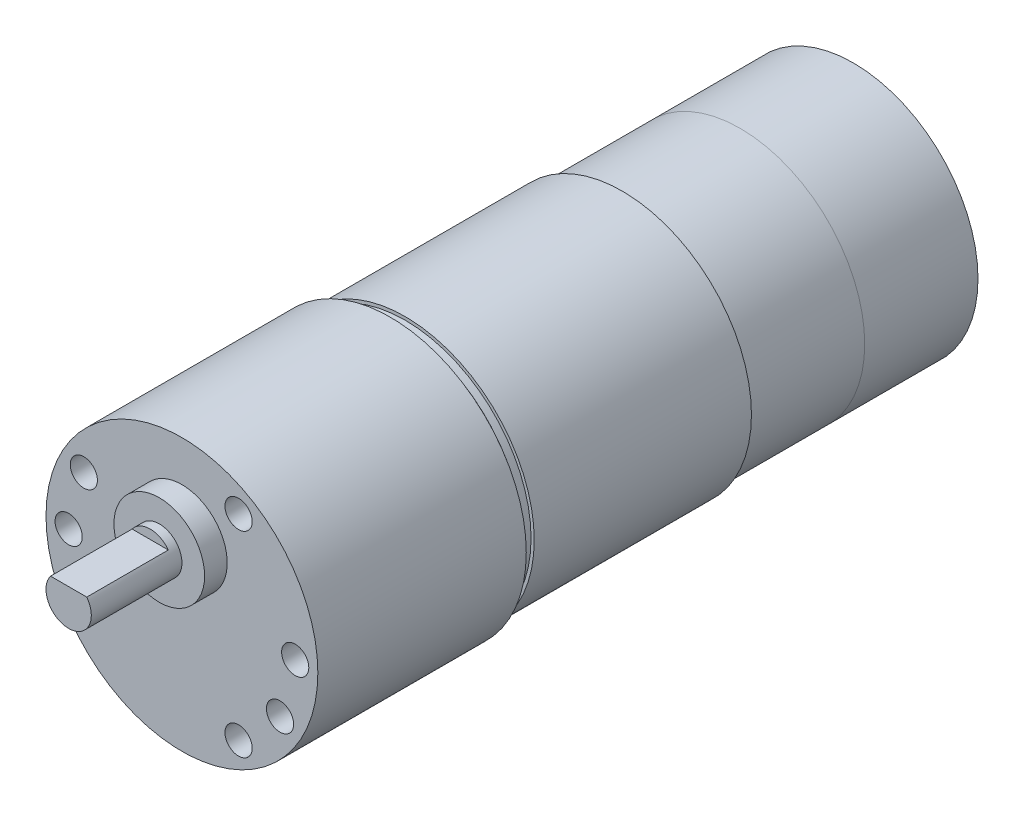
ISO-10303-21;
HEADER;
FILE_DESCRIPTION(('STEP AP214'),'2;1');
FILE_NAME('part.step','',(''),(''),'','','');
FILE_SCHEMA(('AUTOMOTIVE_DESIGN { 1 0 10303 214 1 1 1 1 }'));
ENDSEC;
DATA;
#1=APPLICATION_CONTEXT('core data for automotive mechanical design processes');
#2=APPLICATION_PROTOCOL_DEFINITION('international standard','automotive_design',2000,#1);
#3=PRODUCT_CONTEXT('',#1,'mechanical');
#4=PRODUCT('Part','Part','',(#3));
#5=PRODUCT_RELATED_PRODUCT_CATEGORY('part','',(#4));
#6=PRODUCT_DEFINITION_FORMATION('','',#4);
#7=PRODUCT_DEFINITION_CONTEXT('part definition',#1,'design');
#8=PRODUCT_DEFINITION('design','',#6,#7);
#9=PRODUCT_DEFINITION_SHAPE('','',#8);
#10=(LENGTH_UNIT() NAMED_UNIT(*) SI_UNIT(.MILLI.,.METRE.));
#11=(NAMED_UNIT(*) PLANE_ANGLE_UNIT() SI_UNIT($,.RADIAN.));
#12=(NAMED_UNIT(*) SI_UNIT($,.STERADIAN.) SOLID_ANGLE_UNIT());
#13=UNCERTAINTY_MEASURE_WITH_UNIT(LENGTH_MEASURE(1.E-05),#10,'distance_accuracy_value','');
#14=(GEOMETRIC_REPRESENTATION_CONTEXT(3) GLOBAL_UNCERTAINTY_ASSIGNED_CONTEXT((#13)) GLOBAL_UNIT_ASSIGNED_CONTEXT((#10,
#11,#12)) REPRESENTATION_CONTEXT('',''));
#15=CARTESIAN_POINT('',(0.,0.,0.));
#16=DIRECTION('',(0.,0.,1.));
#17=DIRECTION('',(1.,0.,0.));
#18=AXIS2_PLACEMENT_3D('',#15,#16,#17);
#19=CARTESIAN_POINT('',(0.,0.,-74.1));
#20=DIRECTION('',(0.,0.,1.));
#21=DIRECTION('',(1.,0.,0.));
#22=AXIS2_PLACEMENT_3D('',#19,#20,#21);
#23=CYLINDRICAL_SURFACE('',#22,13.75);
#24=CARTESIAN_POINT('',(0.,0.,-74.1));
#25=DIRECTION('',(0.,0.,-1.));
#26=DIRECTION('',(-1.,0.,0.));
#27=AXIS2_PLACEMENT_3D('',#24,#25,#26);
#28=CIRCLE('',#27,13.75);
#29=CARTESIAN_POINT('',(-13.75,0.,-74.1));
#30=VERTEX_POINT('',#29);
#31=EDGE_CURVE('E11',#30,#30,#28,.T.);
#32=ORIENTED_EDGE('',*,*,#31,.F.);
#33=EDGE_LOOP('',(#32));
#34=FACE_BOUND('',#33,.T.);
#35=CARTESIAN_POINT('',(0.,0.,-61.6));
#36=DIRECTION('',(0.,0.,-1.));
#37=DIRECTION('',(-1.,0.,0.));
#38=AXIS2_PLACEMENT_3D('',#35,#36,#37);
#39=CIRCLE('',#38,13.75);
#40=CARTESIAN_POINT('',(-13.75,0.,-61.6));
#41=VERTEX_POINT('',#40);
#42=EDGE_CURVE('E48',#41,#41,#39,.T.);
#43=ORIENTED_EDGE('',*,*,#42,.T.);
#44=EDGE_LOOP('',(#43));
#45=FACE_BOUND('',#44,.T.);
#46=ADVANCED_FACE('F45',(#34,#45),#23,.T.);
#47=CARTESIAN_POINT('',(0.,0.,-74.1));
#48=DIRECTION('',(0.,0.,-1.));
#49=DIRECTION('',(-1.,0.,0.));
#50=AXIS2_PLACEMENT_3D('',#47,#48,#49);
#51=PLANE('',#50);
#52=ORIENTED_EDGE('',*,*,#31,.T.);
#53=EDGE_LOOP('',(#52));
#54=FACE_BOUND('',#53,.T.);
#55=ADVANCED_FACE('F60',(#54),#51,.T.);
#56=CARTESIAN_POINT('',(0.,0.,-61.6));
#57=DIRECTION('',(0.,0.,-1.));
#58=DIRECTION('',(-1.,0.,0.));
#59=AXIS2_PLACEMENT_3D('',#56,#57,#58);
#60=PLANE('',#59);
#61=ORIENTED_EDGE('',*,*,#42,.F.);
#62=EDGE_LOOP('',(#61));
#63=FACE_BOUND('',#62,.T.);
#64=ADVANCED_FACE('F58',(#63),#60,.F.);
#65=CLOSED_SHELL('',(#46,#55,#64));
#66=MANIFOLD_SOLID_BREP('B2',#65);
#67=CARTESIAN_POINT('',(0.,5.5,2.5));
#68=DIRECTION('',(0.,0.,1.));
#69=DIRECTION('',(1.,0.,0.));
#70=AXIS2_PLACEMENT_3D('',#67,#68,#69);
#71=PLANE('',#70);
#72=CARTESIAN_POINT('',(0.,5.5,2.5));
#73=DIRECTION('',(0.,0.,1.));
#74=DIRECTION('',(1.,0.,0.));
#75=AXIS2_PLACEMENT_3D('',#72,#73,#74);
#76=CIRCLE('',#75,5.);
#77=CARTESIAN_POINT('',(5.,5.5,2.5));
#78=VERTEX_POINT('',#77);
#79=EDGE_CURVE('E138',#78,#78,#76,.T.);
#80=ORIENTED_EDGE('',*,*,#79,.T.);
#81=EDGE_LOOP('',(#80));
#82=FACE_BOUND('',#81,.T.);
#83=CARTESIAN_POINT('',(0.,5.5,2.5));
#84=DIRECTION('',(0.,0.,1.));
#85=DIRECTION('',(1.,0.,0.));
#86=AXIS2_PLACEMENT_3D('',#83,#84,#85);
#87=CIRCLE('',#86,2.5);
#88=CARTESIAN_POINT('',(2.5,5.5,2.5));
#89=VERTEX_POINT('',#88);
#90=EDGE_CURVE('E139',#89,#89,#87,.T.);
#91=ORIENTED_EDGE('',*,*,#90,.F.);
#92=EDGE_LOOP('',(#91));
#93=FACE_BOUND('',#92,.T.);
#94=ADVANCED_FACE('F100',(#82,#93),#71,.T.);
#95=CARTESIAN_POINT('',(0.,0.,0.));
#96=DIRECTION('',(0.,0.,-1.));
#97=DIRECTION('',(-1.,0.,0.));
#98=AXIS2_PLACEMENT_3D('',#95,#96,#97);
#99=PLANE('',#98);
#100=CARTESIAN_POINT('',(0.,0.,0.));
#101=DIRECTION('',(0.,0.,1.));
#102=DIRECTION('',(1.,0.,0.));
#103=AXIS2_PLACEMENT_3D('',#100,#101,#102);
#104=CIRCLE('',#103,15.);
#105=CARTESIAN_POINT('',(15.,0.,0.));
#106=VERTEX_POINT('',#105);
#107=EDGE_CURVE('E210',#106,#106,#104,.T.);
#108=ORIENTED_EDGE('',*,*,#107,.T.);
#109=EDGE_LOOP('',(#108));
#110=FACE_BOUND('',#109,.T.);
#111=CARTESIAN_POINT('',(-12.5,0.,0.));
#112=DIRECTION('',(0.,0.,1.));
#113=DIRECTION('',(1.,0.,0.));
#114=AXIS2_PLACEMENT_3D('',#111,#112,#113);
#115=CIRCLE('',#114,1.5);
#116=CARTESIAN_POINT('',(-11.,0.,0.));
#117=VERTEX_POINT('',#116);
#118=EDGE_CURVE('E175',#117,#117,#115,.T.);
#119=ORIENTED_EDGE('',*,*,#118,.F.);
#120=EDGE_LOOP('',(#119));
#121=FACE_BOUND('',#120,.T.);
#122=CARTESIAN_POINT('',(-10.8253175473055,6.24999999999993,0.));
#123=DIRECTION('',(0.,0.,1.));
#124=DIRECTION('',(1.,0.,0.));
#125=AXIS2_PLACEMENT_3D('',#122,#123,#124);
#126=CIRCLE('',#125,1.5);
#127=CARTESIAN_POINT('',(-9.32531754730552,6.24999999999993,0.));
#128=VERTEX_POINT('',#127);
#129=EDGE_CURVE('E169',#128,#128,#126,.T.);
#130=ORIENTED_EDGE('',*,*,#129,.F.);
#131=EDGE_LOOP('',(#130));
#132=FACE_BOUND('',#131,.T.);
#133=CARTESIAN_POINT('',(6.24999999999997,10.8253175473055,0.));
#134=DIRECTION('',(0.,0.,1.));
#135=DIRECTION('',(1.,0.,0.));
#136=AXIS2_PLACEMENT_3D('',#133,#134,#135);
#137=CIRCLE('',#136,1.5);
#138=CARTESIAN_POINT('',(7.74999999999997,10.8253175473055,0.));
#139=VERTEX_POINT('',#138);
#140=EDGE_CURVE('E163',#139,#139,#137,.T.);
#141=ORIENTED_EDGE('',*,*,#140,.F.);
#142=EDGE_LOOP('',(#141));
#143=FACE_BOUND('',#142,.T.);
#144=CARTESIAN_POINT('',(12.5,0.,0.));
#145=DIRECTION('',(0.,0.,1.));
#146=DIRECTION('',(1.,0.,0.));
#147=AXIS2_PLACEMENT_3D('',#144,#145,#146);
#148=CIRCLE('',#147,1.5);
#149=CARTESIAN_POINT('',(14.,0.,0.));
#150=VERTEX_POINT('',#149);
#151=EDGE_CURVE('E157',#150,#150,#148,.T.);
#152=ORIENTED_EDGE('',*,*,#151,.F.);
#153=EDGE_LOOP('',(#152));
#154=FACE_BOUND('',#153,.T.);
#155=CARTESIAN_POINT('',(10.8253175473055,-6.25000000000001,0.));
#156=DIRECTION('',(0.,0.,1.));
#157=DIRECTION('',(1.,0.,0.));
#158=AXIS2_PLACEMENT_3D('',#155,#156,#157);
#159=CIRCLE('',#158,1.5);
#160=CARTESIAN_POINT('',(12.3253175473055,-6.25000000000001,0.));
#161=VERTEX_POINT('',#160);
#162=EDGE_CURVE('E151',#161,#161,#159,.T.);
#163=ORIENTED_EDGE('',*,*,#162,.F.);
#164=EDGE_LOOP('',(#163));
#165=FACE_BOUND('',#164,.T.);
#166=CARTESIAN_POINT('',(6.24999999999998,-10.8253175473055,0.));
#167=DIRECTION('',(0.,0.,1.));
#168=DIRECTION('',(1.,0.,0.));
#169=AXIS2_PLACEMENT_3D('',#166,#167,#168);
#170=CIRCLE('',#169,1.5);
#171=CARTESIAN_POINT('',(7.74999999999998,-10.8253175473055,0.));
#172=VERTEX_POINT('',#171);
#173=EDGE_CURVE('E142',#172,#172,#170,.T.);
#174=ORIENTED_EDGE('',*,*,#173,.F.);
#175=EDGE_LOOP('',(#174));
#176=FACE_BOUND('',#175,.T.);
#177=CARTESIAN_POINT('',(0.,5.5,0.));
#178=DIRECTION('',(0.,0.,-1.));
#179=DIRECTION('',(-1.,0.,0.));
#180=AXIS2_PLACEMENT_3D('',#177,#178,#179);
#181=CIRCLE('',#180,5.);
#182=CARTESIAN_POINT('',(-5.,5.5,0.));
#183=VERTEX_POINT('',#182);
#184=EDGE_CURVE('E129',#183,#183,#181,.F.);
#185=ORIENTED_EDGE('',*,*,#184,.F.);
#186=EDGE_LOOP('',(#185));
#187=FACE_BOUND('',#186,.T.);
#188=ADVANCED_FACE('F102',(#110,#121,#132,#143,#154,#165,#176,#187),#99,.F.);
#189=CARTESIAN_POINT('',(0.,0.,0.));
#190=DIRECTION('',(0.,0.,1.));
#191=DIRECTION('',(1.,0.,0.));
#192=AXIS2_PLACEMENT_3D('',#189,#190,#191);
#193=CYLINDRICAL_SURFACE('',#192,15.);
#194=ORIENTED_EDGE('',*,*,#107,.F.);
#195=EDGE_LOOP('',(#194));
#196=FACE_BOUND('',#195,.T.);
#197=CARTESIAN_POINT('',(0.,0.,-23.));
#198=DIRECTION('',(0.,0.,1.));
#199=DIRECTION('',(1.,0.,0.));
#200=AXIS2_PLACEMENT_3D('',#197,#198,#199);
#201=CIRCLE('',#200,15.);
#202=CARTESIAN_POINT('',(15.,0.,-23.));
#203=VERTEX_POINT('',#202);
#204=EDGE_CURVE('E207',#203,#203,#201,.T.);
#205=ORIENTED_EDGE('',*,*,#204,.T.);
#206=EDGE_LOOP('',(#205));
#207=FACE_BOUND('',#206,.T.);
#208=ADVANCED_FACE('F219',(#196,#207),#193,.T.);
#209=CARTESIAN_POINT('',(0.,15.,-23.));
#210=DIRECTION('',(0.,0.,1.));
#211=DIRECTION('',(1.,0.,0.));
#212=AXIS2_PLACEMENT_3D('',#209,#210,#211);
#213=PLANE('',#212);
#214=ORIENTED_EDGE('',*,*,#204,.F.);
#215=EDGE_LOOP('',(#214));
#216=FACE_BOUND('',#215,.T.);
#217=CARTESIAN_POINT('',(0.,0.,-23.));
#218=DIRECTION('',(0.,0.,1.));
#219=DIRECTION('',(1.,0.,0.));
#220=AXIS2_PLACEMENT_3D('',#217,#218,#219);
#221=CIRCLE('',#220,13.1608692238094);
#222=CARTESIAN_POINT('',(13.1608692238094,0.,-23.));
#223=VERTEX_POINT('',#222);
#224=EDGE_CURVE('E204',#223,#223,#221,.T.);
#225=ORIENTED_EDGE('',*,*,#224,.T.);
#226=EDGE_LOOP('',(#225));
#227=FACE_BOUND('',#226,.T.);
#228=ADVANCED_FACE('F225',(#216,#227),#213,.F.);
#229=CARTESIAN_POINT('',(0.,0.,0.));
#230=DIRECTION('',(0.,0.,1.));
#231=DIRECTION('',(1.,0.,0.));
#232=AXIS2_PLACEMENT_3D('',#229,#230,#231);
#233=CYLINDRICAL_SURFACE('',#232,13.1608692238094);
#234=ORIENTED_EDGE('',*,*,#224,.F.);
#235=EDGE_LOOP('',(#234));
#236=FACE_BOUND('',#235,.T.);
#237=CARTESIAN_POINT('',(0.,0.,-23.8));
#238=DIRECTION('',(0.,0.,1.));
#239=DIRECTION('',(1.,0.,0.));
#240=AXIS2_PLACEMENT_3D('',#237,#238,#239);
#241=CIRCLE('',#240,13.1608692238094);
#242=CARTESIAN_POINT('',(13.1608692238094,0.,-23.8));
#243=VERTEX_POINT('',#242);
#244=EDGE_CURVE('E201',#243,#243,#241,.T.);
#245=ORIENTED_EDGE('',*,*,#244,.T.);
#246=EDGE_LOOP('',(#245));
#247=FACE_BOUND('',#246,.T.);
#248=ADVANCED_FACE('F323',(#236,#247),#233,.T.);
#249=CARTESIAN_POINT('',(0.,13.1608692238094,-23.8));
#250=DIRECTION('',(0.,0.,-1.));
#251=DIRECTION('',(-1.,0.,0.));
#252=AXIS2_PLACEMENT_3D('',#249,#250,#251);
#253=PLANE('',#252);
#254=ORIENTED_EDGE('',*,*,#244,.F.);
#255=EDGE_LOOP('',(#254));
#256=FACE_BOUND('',#255,.T.);
#257=CARTESIAN_POINT('',(0.,0.,-23.8));
#258=DIRECTION('',(0.,0.,1.));
#259=DIRECTION('',(1.,0.,0.));
#260=AXIS2_PLACEMENT_3D('',#257,#258,#259);
#261=CIRCLE('',#260,13.9001885477519);
#262=CARTESIAN_POINT('',(13.9001885477519,0.,-23.8));
#263=VERTEX_POINT('',#262);
#264=EDGE_CURVE('E198',#263,#263,#261,.T.);
#265=ORIENTED_EDGE('',*,*,#264,.T.);
#266=EDGE_LOOP('',(#265));
#267=FACE_BOUND('',#266,.T.);
#268=ADVANCED_FACE('F319',(#256,#267),#253,.F.);
#269=CARTESIAN_POINT('',(0.,0.,0.));
#270=DIRECTION('',(0.,0.,1.));
#271=DIRECTION('',(1.,0.,0.));
#272=AXIS2_PLACEMENT_3D('',#269,#270,#271);
#273=CYLINDRICAL_SURFACE('',#272,13.9001885477519);
#274=ORIENTED_EDGE('',*,*,#264,.F.);
#275=EDGE_LOOP('',(#274));
#276=FACE_BOUND('',#275,.T.);
#277=CARTESIAN_POINT('',(0.,0.,-24.6291574327881));
#278=DIRECTION('',(0.,0.,1.));
#279=DIRECTION('',(1.,0.,0.));
#280=AXIS2_PLACEMENT_3D('',#277,#278,#279);
#281=CIRCLE('',#280,13.9001885477519);
#282=CARTESIAN_POINT('',(13.9001885477519,0.,-24.6291574327881));
#283=VERTEX_POINT('',#282);
#284=EDGE_CURVE('E195',#283,#283,#281,.T.);
#285=ORIENTED_EDGE('',*,*,#284,.T.);
#286=EDGE_LOOP('',(#285));
#287=FACE_BOUND('',#286,.T.);
#288=ADVANCED_FACE('F315',(#276,#287),#273,.T.);
#289=CARTESIAN_POINT('',(0.,13.9001885477519,-24.6291574327881));
#290=DIRECTION('',(0.,0.,-1.));
#291=DIRECTION('',(-1.,0.,0.));
#292=AXIS2_PLACEMENT_3D('',#289,#290,#291);
#293=PLANE('',#292);
#294=ORIENTED_EDGE('',*,*,#284,.F.);
#295=EDGE_LOOP('',(#294));
#296=FACE_BOUND('',#295,.T.);
#297=CARTESIAN_POINT('',(0.,0.,-24.6291574327881));
#298=DIRECTION('',(0.,0.,1.));
#299=DIRECTION('',(1.,0.,0.));
#300=AXIS2_PLACEMENT_3D('',#297,#298,#299);
#301=CIRCLE('',#300,14.25);
#302=CARTESIAN_POINT('',(14.25,0.,-24.6291574327881));
#303=VERTEX_POINT('',#302);
#304=EDGE_CURVE('E192',#303,#303,#301,.T.);
#305=ORIENTED_EDGE('',*,*,#304,.T.);
#306=EDGE_LOOP('',(#305));
#307=FACE_BOUND('',#306,.T.);
#308=ADVANCED_FACE('F311',(#296,#307),#293,.F.);
#309=CARTESIAN_POINT('',(0.,0.,0.));
#310=DIRECTION('',(0.,0.,1.));
#311=DIRECTION('',(1.,0.,0.));
#312=AXIS2_PLACEMENT_3D('',#309,#310,#311);
#313=CYLINDRICAL_SURFACE('',#312,14.25);
#314=ORIENTED_EDGE('',*,*,#304,.F.);
#315=EDGE_LOOP('',(#314));
#316=FACE_BOUND('',#315,.T.);
#317=CARTESIAN_POINT('',(0.,0.,-48.6));
#318=DIRECTION('',(0.,0.,1.));
#319=DIRECTION('',(1.,0.,0.));
#320=AXIS2_PLACEMENT_3D('',#317,#318,#319);
#321=CIRCLE('',#320,14.25);
#322=CARTESIAN_POINT('',(14.25,0.,-48.6));
#323=VERTEX_POINT('',#322);
#324=EDGE_CURVE('E189',#323,#323,#321,.T.);
#325=ORIENTED_EDGE('',*,*,#324,.T.);
#326=EDGE_LOOP('',(#325));
#327=FACE_BOUND('',#326,.T.);
#328=ADVANCED_FACE('F307',(#316,#327),#313,.T.);
#329=CARTESIAN_POINT('',(0.,14.25,-48.6));
#330=DIRECTION('',(0.,0.,1.));
#331=DIRECTION('',(1.,0.,0.));
#332=AXIS2_PLACEMENT_3D('',#329,#330,#331);
#333=PLANE('',#332);
#334=ORIENTED_EDGE('',*,*,#324,.F.);
#335=EDGE_LOOP('',(#334));
#336=FACE_BOUND('',#335,.T.);
#337=CARTESIAN_POINT('',(0.,0.,-48.6));
#338=DIRECTION('',(0.,0.,1.));
#339=DIRECTION('',(1.,0.,0.));
#340=AXIS2_PLACEMENT_3D('',#337,#338,#339);
#341=CIRCLE('',#340,13.75);
#342=CARTESIAN_POINT('',(13.75,0.,-48.6));
#343=VERTEX_POINT('',#342);
#344=EDGE_CURVE('E186',#343,#343,#341,.T.);
#345=ORIENTED_EDGE('',*,*,#344,.T.);
#346=EDGE_LOOP('',(#345));
#347=FACE_BOUND('',#346,.T.);
#348=ADVANCED_FACE('F303',(#336,#347),#333,.F.);
#349=CARTESIAN_POINT('',(0.,0.,0.));
#350=DIRECTION('',(0.,0.,1.));
#351=DIRECTION('',(1.,0.,0.));
#352=AXIS2_PLACEMENT_3D('',#349,#350,#351);
#353=CYLINDRICAL_SURFACE('',#352,13.75);
#354=ORIENTED_EDGE('',*,*,#344,.F.);
#355=EDGE_LOOP('',(#354));
#356=FACE_BOUND('',#355,.T.);
#357=CARTESIAN_POINT('',(0.,0.,-61.6));
#358=DIRECTION('',(0.,0.,1.));
#359=DIRECTION('',(1.,0.,0.));
#360=AXIS2_PLACEMENT_3D('',#357,#358,#359);
#361=CIRCLE('',#360,13.75);
#362=CARTESIAN_POINT('',(13.75,0.,-61.6));
#363=VERTEX_POINT('',#362);
#364=EDGE_CURVE('E181',#363,#363,#361,.T.);
#365=ORIENTED_EDGE('',*,*,#364,.T.);
#366=EDGE_LOOP('',(#365));
#367=FACE_BOUND('',#366,.T.);
#368=ADVANCED_FACE('F299',(#356,#367),#353,.T.);
#369=CARTESIAN_POINT('',(0.,13.75,-61.6));
#370=DIRECTION('',(0.,0.,1.));
#371=DIRECTION('',(1.,0.,0.));
#372=AXIS2_PLACEMENT_3D('',#369,#370,#371);
#373=PLANE('',#372);
#374=ORIENTED_EDGE('',*,*,#364,.F.);
#375=EDGE_LOOP('',(#374));
#376=FACE_BOUND('',#375,.T.);
#377=ADVANCED_FACE('F295',(#376),#373,.F.);
#378=CARTESIAN_POINT('',(-12.5,0.,-4.));
#379=DIRECTION('',(0.,0.,1.));
#380=DIRECTION('',(1.,0.,0.));
#381=AXIS2_PLACEMENT_3D('',#378,#379,#380);
#382=CYLINDRICAL_SURFACE('',#381,1.5);
#383=CARTESIAN_POINT('',(-12.5,0.,-4.));
#384=DIRECTION('',(0.,0.,1.));
#385=DIRECTION('',(1.,0.,0.));
#386=AXIS2_PLACEMENT_3D('',#383,#384,#385);
#387=CIRCLE('',#386,1.5);
#388=CARTESIAN_POINT('',(-11.,0.,-4.));
#389=VERTEX_POINT('',#388);
#390=EDGE_CURVE('E178',#389,#389,#387,.T.);
#391=ORIENTED_EDGE('',*,*,#390,.F.);
#392=EDGE_LOOP('',(#391));
#393=FACE_BOUND('',#392,.T.);
#394=ORIENTED_EDGE('',*,*,#118,.T.);
#395=EDGE_LOOP('',(#394));
#396=FACE_BOUND('',#395,.T.);
#397=ADVANCED_FACE('F291',(#393,#396),#382,.F.);
#398=CARTESIAN_POINT('',(-12.5,0.,-4.));
#399=DIRECTION('',(0.,0.,1.));
#400=DIRECTION('',(1.,0.,0.));
#401=AXIS2_PLACEMENT_3D('',#398,#399,#400);
#402=PLANE('',#401);
#403=ORIENTED_EDGE('',*,*,#390,.T.);
#404=EDGE_LOOP('',(#403));
#405=FACE_BOUND('',#404,.T.);
#406=ADVANCED_FACE('F287',(#405),#402,.T.);
#407=CARTESIAN_POINT('',(-10.8253175473055,6.24999999999993,-4.));
#408=DIRECTION('',(0.,0.,1.));
#409=DIRECTION('',(1.,0.,0.));
#410=AXIS2_PLACEMENT_3D('',#407,#408,#409);
#411=CYLINDRICAL_SURFACE('',#410,1.5);
#412=CARTESIAN_POINT('',(-10.8253175473055,6.24999999999993,-4.));
#413=DIRECTION('',(0.,0.,1.));
#414=DIRECTION('',(1.,0.,0.));
#415=AXIS2_PLACEMENT_3D('',#412,#413,#414);
#416=CIRCLE('',#415,1.5);
#417=CARTESIAN_POINT('',(-9.32531754730552,6.24999999999993,-4.));
#418=VERTEX_POINT('',#417);
#419=EDGE_CURVE('E172',#418,#418,#416,.T.);
#420=ORIENTED_EDGE('',*,*,#419,.F.);
#421=EDGE_LOOP('',(#420));
#422=FACE_BOUND('',#421,.T.);
#423=ORIENTED_EDGE('',*,*,#129,.T.);
#424=EDGE_LOOP('',(#423));
#425=FACE_BOUND('',#424,.T.);
#426=ADVANCED_FACE('F283',(#422,#425),#411,.F.);
#427=CARTESIAN_POINT('',(-10.8253175473055,6.24999999999993,-4.));
#428=DIRECTION('',(0.,0.,1.));
#429=DIRECTION('',(1.,0.,0.));
#430=AXIS2_PLACEMENT_3D('',#427,#428,#429);
#431=PLANE('',#430);
#432=ORIENTED_EDGE('',*,*,#419,.T.);
#433=EDGE_LOOP('',(#432));
#434=FACE_BOUND('',#433,.T.);
#435=ADVANCED_FACE('F279',(#434),#431,.T.);
#436=CARTESIAN_POINT('',(6.24999999999997,10.8253175473055,-4.));
#437=DIRECTION('',(0.,0.,1.));
#438=DIRECTION('',(1.,0.,0.));
#439=AXIS2_PLACEMENT_3D('',#436,#437,#438);
#440=CYLINDRICAL_SURFACE('',#439,1.5);
#441=CARTESIAN_POINT('',(6.24999999999997,10.8253175473055,-4.));
#442=DIRECTION('',(0.,0.,1.));
#443=DIRECTION('',(1.,0.,0.));
#444=AXIS2_PLACEMENT_3D('',#441,#442,#443);
#445=CIRCLE('',#444,1.5);
#446=CARTESIAN_POINT('',(7.74999999999997,10.8253175473055,-4.));
#447=VERTEX_POINT('',#446);
#448=EDGE_CURVE('E166',#447,#447,#445,.T.);
#449=ORIENTED_EDGE('',*,*,#448,.F.);
#450=EDGE_LOOP('',(#449));
#451=FACE_BOUND('',#450,.T.);
#452=ORIENTED_EDGE('',*,*,#140,.T.);
#453=EDGE_LOOP('',(#452));
#454=FACE_BOUND('',#453,.T.);
#455=ADVANCED_FACE('F275',(#451,#454),#440,.F.);
#456=CARTESIAN_POINT('',(6.24999999999997,10.8253175473055,-4.));
#457=DIRECTION('',(0.,0.,1.));
#458=DIRECTION('',(1.,0.,0.));
#459=AXIS2_PLACEMENT_3D('',#456,#457,#458);
#460=PLANE('',#459);
#461=ORIENTED_EDGE('',*,*,#448,.T.);
#462=EDGE_LOOP('',(#461));
#463=FACE_BOUND('',#462,.T.);
#464=ADVANCED_FACE('F271',(#463),#460,.T.);
#465=CARTESIAN_POINT('',(12.5,0.,-4.));
#466=DIRECTION('',(0.,0.,1.));
#467=DIRECTION('',(1.,0.,0.));
#468=AXIS2_PLACEMENT_3D('',#465,#466,#467);
#469=CYLINDRICAL_SURFACE('',#468,1.5);
#470=CARTESIAN_POINT('',(12.5,0.,-4.));
#471=DIRECTION('',(0.,0.,1.));
#472=DIRECTION('',(1.,0.,0.));
#473=AXIS2_PLACEMENT_3D('',#470,#471,#472);
#474=CIRCLE('',#473,1.5);
#475=CARTESIAN_POINT('',(14.,0.,-4.));
#476=VERTEX_POINT('',#475);
#477=EDGE_CURVE('E160',#476,#476,#474,.T.);
#478=ORIENTED_EDGE('',*,*,#477,.F.);
#479=EDGE_LOOP('',(#478));
#480=FACE_BOUND('',#479,.T.);
#481=ORIENTED_EDGE('',*,*,#151,.T.);
#482=EDGE_LOOP('',(#481));
#483=FACE_BOUND('',#482,.T.);
#484=ADVANCED_FACE('F267',(#480,#483),#469,.F.);
#485=CARTESIAN_POINT('',(12.5,0.,-4.));
#486=DIRECTION('',(0.,0.,1.));
#487=DIRECTION('',(1.,0.,0.));
#488=AXIS2_PLACEMENT_3D('',#485,#486,#487);
#489=PLANE('',#488);
#490=ORIENTED_EDGE('',*,*,#477,.T.);
#491=EDGE_LOOP('',(#490));
#492=FACE_BOUND('',#491,.T.);
#493=ADVANCED_FACE('F263',(#492),#489,.T.);
#494=CARTESIAN_POINT('',(10.8253175473055,-6.25000000000001,-4.));
#495=DIRECTION('',(0.,0.,1.));
#496=DIRECTION('',(1.,0.,0.));
#497=AXIS2_PLACEMENT_3D('',#494,#495,#496);
#498=CYLINDRICAL_SURFACE('',#497,1.5);
#499=CARTESIAN_POINT('',(10.8253175473055,-6.25000000000001,-4.));
#500=DIRECTION('',(0.,0.,1.));
#501=DIRECTION('',(1.,0.,0.));
#502=AXIS2_PLACEMENT_3D('',#499,#500,#501);
#503=CIRCLE('',#502,1.5);
#504=CARTESIAN_POINT('',(12.3253175473055,-6.25000000000001,-4.));
#505=VERTEX_POINT('',#504);
#506=EDGE_CURVE('E154',#505,#505,#503,.T.);
#507=ORIENTED_EDGE('',*,*,#506,.F.);
#508=EDGE_LOOP('',(#507));
#509=FACE_BOUND('',#508,.T.);
#510=ORIENTED_EDGE('',*,*,#162,.T.);
#511=EDGE_LOOP('',(#510));
#512=FACE_BOUND('',#511,.T.);
#513=ADVANCED_FACE('F255',(#509,#512),#498,.F.);
#514=CARTESIAN_POINT('',(10.8253175473055,-6.25000000000001,-4.));
#515=DIRECTION('',(0.,0.,1.));
#516=DIRECTION('',(1.,0.,0.));
#517=AXIS2_PLACEMENT_3D('',#514,#515,#516);
#518=PLANE('',#517);
#519=ORIENTED_EDGE('',*,*,#506,.T.);
#520=EDGE_LOOP('',(#519));
#521=FACE_BOUND('',#520,.T.);
#522=ADVANCED_FACE('F246',(#521),#518,.T.);
#523=CARTESIAN_POINT('',(6.24999999999998,-10.8253175473055,-4.));
#524=DIRECTION('',(0.,0.,1.));
#525=DIRECTION('',(1.,0.,0.));
#526=AXIS2_PLACEMENT_3D('',#523,#524,#525);
#527=CYLINDRICAL_SURFACE('',#526,1.5);
#528=CARTESIAN_POINT('',(6.24999999999998,-10.8253175473055,-4.));
#529=DIRECTION('',(0.,0.,1.));
#530=DIRECTION('',(1.,0.,0.));
#531=AXIS2_PLACEMENT_3D('',#528,#529,#530);
#532=CIRCLE('',#531,1.5);
#533=CARTESIAN_POINT('',(7.74999999999998,-10.8253175473055,-4.));
#534=VERTEX_POINT('',#533);
#535=EDGE_CURVE('E148',#534,#534,#532,.T.);
#536=ORIENTED_EDGE('',*,*,#535,.F.);
#537=EDGE_LOOP('',(#536));
#538=FACE_BOUND('',#537,.T.);
#539=ORIENTED_EDGE('',*,*,#173,.T.);
#540=EDGE_LOOP('',(#539));
#541=FACE_BOUND('',#540,.T.);
#542=ADVANCED_FACE('F243',(#538,#541),#527,.F.);
#543=CARTESIAN_POINT('',(6.24999999999998,-10.8253175473055,-4.));
#544=DIRECTION('',(0.,0.,1.));
#545=DIRECTION('',(1.,0.,0.));
#546=AXIS2_PLACEMENT_3D('',#543,#544,#545);
#547=PLANE('',#546);
#548=ORIENTED_EDGE('',*,*,#535,.T.);
#549=EDGE_LOOP('',(#548));
#550=FACE_BOUND('',#549,.T.);
#551=ADVANCED_FACE('F245',(#550),#547,.T.);
#552=CARTESIAN_POINT('',(0.,5.5,2.5));
#553=DIRECTION('',(0.,0.,-1.));
#554=DIRECTION('',(-1.,0.,0.));
#555=AXIS2_PLACEMENT_3D('',#552,#553,#554);
#556=CYLINDRICAL_SURFACE('',#555,5.);
#557=ORIENTED_EDGE('',*,*,#79,.F.);
#558=EDGE_LOOP('',(#557));
#559=FACE_BOUND('',#558,.T.);
#560=ORIENTED_EDGE('',*,*,#184,.T.);
#561=EDGE_LOOP('',(#560));
#562=FACE_BOUND('',#561,.T.);
#563=ADVANCED_FACE('F216',(#559,#562),#556,.T.);
#564=CARTESIAN_POINT('',(0.,5.5,12.5));
#565=DIRECTION('',(0.,0.,-1.));
#566=DIRECTION('',(-1.,0.,0.));
#567=AXIS2_PLACEMENT_3D('',#564,#565,#566);
#568=CYLINDRICAL_SURFACE('',#567,2.5);
#569=CARTESIAN_POINT('',(0.,5.5,12.5));
#570=DIRECTION('',(0.,0.,1.));
#571=DIRECTION('',(1.,0.,0.));
#572=AXIS2_PLACEMENT_3D('',#569,#570,#571);
#573=CIRCLE('',#572,2.5);
#574=CARTESIAN_POINT('',(-2.,7.,12.5));
#575=VERTEX_POINT('',#574);
#576=CARTESIAN_POINT('',(2.,7.,12.5));
#577=VERTEX_POINT('',#576);
#578=EDGE_CURVE('E134',#575,#577,#573,.T.);
#579=ORIENTED_EDGE('',*,*,#578,.F.);
#580=DIRECTION('',(0.,0.,-1.));
#581=VECTOR('',#580,1.);
#582=CARTESIAN_POINT('',(-2.,7.,12.5));
#583=LINE('',#582,#581);
#584=CARTESIAN_POINT('',(-2.,7.,3.5));
#585=VERTEX_POINT('',#584);
#586=EDGE_CURVE('E115',#575,#585,#583,.T.);
#587=ORIENTED_EDGE('',*,*,#586,.T.);
#588=CARTESIAN_POINT('',(0.,5.5,3.5));
#589=DIRECTION('',(0.,0.,1.));
#590=DIRECTION('',(1.,0.,0.));
#591=AXIS2_PLACEMENT_3D('',#588,#589,#590);
#592=CIRCLE('',#591,2.5);
#593=CARTESIAN_POINT('',(2.,7.,3.5));
#594=VERTEX_POINT('',#593);
#595=EDGE_CURVE('E43',#594,#585,#592,.T.);
#596=ORIENTED_EDGE('',*,*,#595,.F.);
#597=DIRECTION('',(0.,0.,-1.));
#598=VECTOR('',#597,1.);
#599=CARTESIAN_POINT('',(2.,7.,12.5));
#600=LINE('',#599,#598);
#601=EDGE_CURVE('E120',#594,#577,#600,.F.);
#602=ORIENTED_EDGE('',*,*,#601,.T.);
#603=EDGE_LOOP('',(#579,#587,#596,#602));
#604=FACE_BOUND('',#603,.T.);
#605=ORIENTED_EDGE('',*,*,#90,.T.);
#606=EDGE_LOOP('',(#605));
#607=FACE_BOUND('',#606,.T.);
#608=ADVANCED_FACE('F132',(#604,#607),#568,.T.);
#609=CARTESIAN_POINT('',(0.,5.5,12.5));
#610=DIRECTION('',(0.,0.,1.));
#611=DIRECTION('',(1.,0.,0.));
#612=AXIS2_PLACEMENT_3D('',#609,#610,#611);
#613=PLANE('',#612);
#614=DIRECTION('',(1.,0.,0.));
#615=VECTOR('',#614,1.);
#616=CARTESIAN_POINT('',(0.,7.,12.5));
#617=LINE('',#616,#615);
#618=EDGE_CURVE('E108',#575,#577,#617,.T.);
#619=ORIENTED_EDGE('',*,*,#618,.F.);
#620=ORIENTED_EDGE('',*,*,#578,.T.);
#621=EDGE_LOOP('',(#619,#620));
#622=FACE_BOUND('',#621,.T.);
#623=ADVANCED_FACE('F137',(#622),#613,.T.);
#624=CARTESIAN_POINT('',(0.,0.,3.5));
#625=DIRECTION('',(0.,0.,1.));
#626=DIRECTION('',(1.,0.,0.));
#627=AXIS2_PLACEMENT_3D('',#624,#625,#626);
#628=PLANE('',#627);
#629=ORIENTED_EDGE('',*,*,#595,.T.);
#630=DIRECTION('',(1.,0.,0.));
#631=VECTOR('',#630,1.);
#632=CARTESIAN_POINT('',(-2.64046696846131,7.,3.5));
#633=LINE('',#632,#631);
#634=EDGE_CURVE('E135',#585,#594,#633,.T.);
#635=ORIENTED_EDGE('',*,*,#634,.T.);
#636=EDGE_LOOP('',(#629,#635));
#637=FACE_BOUND('',#636,.T.);
#638=ADVANCED_FACE('F469',(#637),#628,.T.);
#639=CARTESIAN_POINT('',(-2.64046696846131,7.,3.5));
#640=DIRECTION('',(0.,-1.,0.));
#641=DIRECTION('',(0.,0.,-1.));
#642=AXIS2_PLACEMENT_3D('',#639,#640,#641);
#643=PLANE('',#642);
#644=ORIENTED_EDGE('',*,*,#618,.T.);
#645=ORIENTED_EDGE('',*,*,#601,.F.);
#646=ORIENTED_EDGE('',*,*,#634,.F.);
#647=ORIENTED_EDGE('',*,*,#586,.F.);
#648=EDGE_LOOP('',(#644,#645,#646,#647));
#649=FACE_BOUND('',#648,.T.);
#650=ADVANCED_FACE('F125',(#649),#643,.F.);
#651=CLOSED_SHELL('',(#94,#188,#208,#228,#248,#268,#288,#308,#328,#348,#368,#377,#397,#406,#426,
#435,#455,#464,#484,#493,#513,#522,#542,#551,#563,#608,#623,#638,#650));
#652=MANIFOLD_SOLID_BREP('B6',#651);
#653=ADVANCED_BREP_SHAPE_REPRESENTATION('',(#18,#66,#652),#14);
#654=SHAPE_DEFINITION_REPRESENTATION(#9,#653);
ENDSEC;
END-ISO-10303-21;
